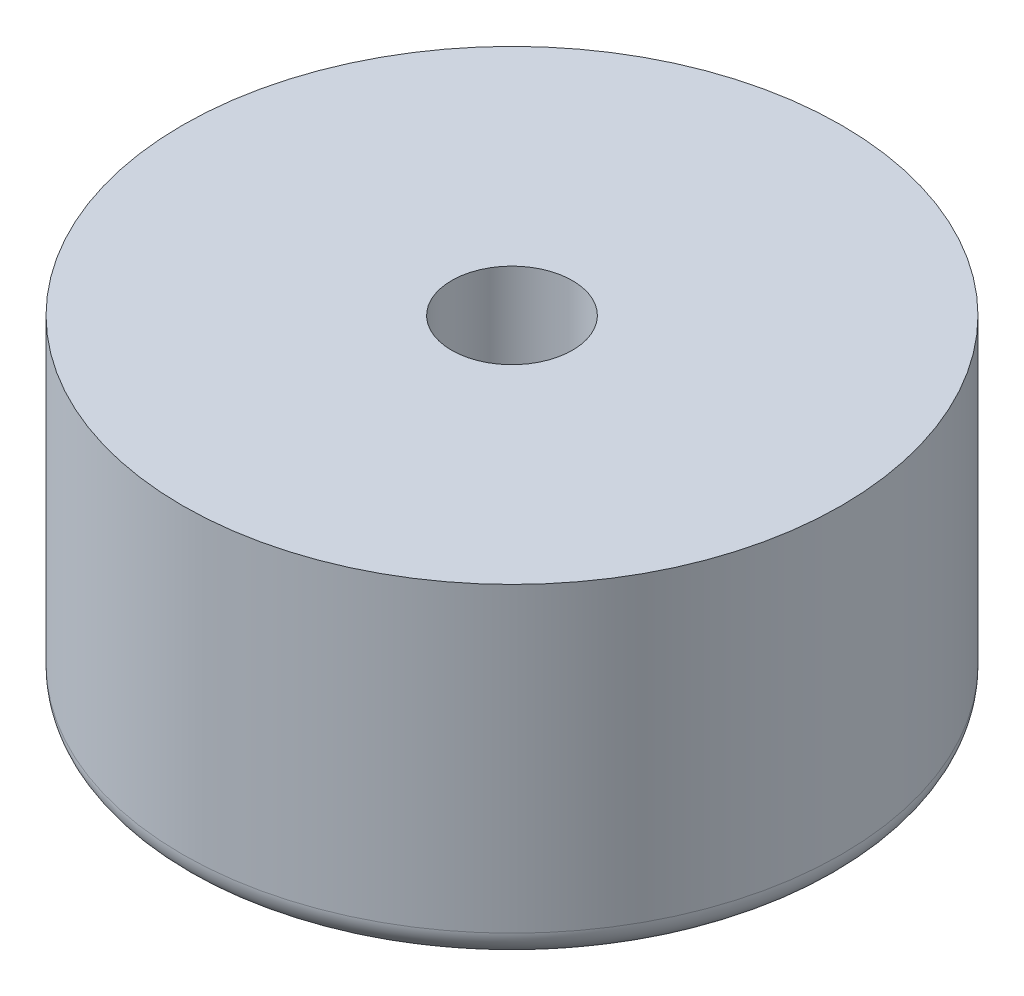
ISO-10303-21;
HEADER;
FILE_DESCRIPTION(('STEP AP214'),'2;1');
FILE_NAME('part.step','',(''),(''),'','','');
FILE_SCHEMA(('AUTOMOTIVE_DESIGN { 1 0 10303 214 1 1 1 1 }'));
ENDSEC;
DATA;
#1=APPLICATION_CONTEXT('core data for automotive mechanical design processes');
#2=APPLICATION_PROTOCOL_DEFINITION('international standard','automotive_design',2000,#1);
#3=PRODUCT_CONTEXT('',#1,'mechanical');
#4=PRODUCT('Part','Part','',(#3));
#5=PRODUCT_RELATED_PRODUCT_CATEGORY('part','',(#4));
#6=PRODUCT_DEFINITION_FORMATION('','',#4);
#7=PRODUCT_DEFINITION_CONTEXT('part definition',#1,'design');
#8=PRODUCT_DEFINITION('design','',#6,#7);
#9=PRODUCT_DEFINITION_SHAPE('','',#8);
#10=(LENGTH_UNIT() NAMED_UNIT(*) SI_UNIT(.MILLI.,.METRE.));
#11=(NAMED_UNIT(*) PLANE_ANGLE_UNIT() SI_UNIT($,.RADIAN.));
#12=(NAMED_UNIT(*) SI_UNIT($,.STERADIAN.) SOLID_ANGLE_UNIT());
#13=UNCERTAINTY_MEASURE_WITH_UNIT(LENGTH_MEASURE(1.E-05),#10,'distance_accuracy_value','');
#14=(GEOMETRIC_REPRESENTATION_CONTEXT(3) GLOBAL_UNCERTAINTY_ASSIGNED_CONTEXT((#13)) GLOBAL_UNIT_ASSIGNED_CONTEXT((#10,
#11,#12)) REPRESENTATION_CONTEXT('',''));
#15=CARTESIAN_POINT('',(0.,0.,0.));
#16=DIRECTION('',(0.,0.,1.));
#17=DIRECTION('',(1.,0.,0.));
#18=AXIS2_PLACEMENT_3D('',#15,#16,#17);
#19=CARTESIAN_POINT('',(0.,6.,0.));
#20=DIRECTION('',(0.,-1.,0.));
#21=DIRECTION('',(0.,0.,-1.));
#22=AXIS2_PLACEMENT_3D('',#19,#20,#21);
#23=CYLINDRICAL_SURFACE('',#22,6.);
#24=CARTESIAN_POINT('',(0.,0.5,0.));
#25=DIRECTION('',(0.,1.,0.));
#26=DIRECTION('',(0.,0.,1.));
#27=AXIS2_PLACEMENT_3D('',#24,#25,#26);
#28=CIRCLE('',#27,6.);
#29=CARTESIAN_POINT('',(0.,0.5,6.));
#30=VERTEX_POINT('',#29);
#31=EDGE_CURVE('E45',#30,#30,#28,.T.);
#32=ORIENTED_EDGE('',*,*,#31,.T.);
#33=EDGE_LOOP('',(#32));
#34=FACE_BOUND('',#33,.T.);
#35=CARTESIAN_POINT('',(0.,6.,0.));
#36=DIRECTION('',(0.,1.,0.));
#37=DIRECTION('',(0.,0.,1.));
#38=AXIS2_PLACEMENT_3D('',#35,#36,#37);
#39=CIRCLE('',#38,6.);
#40=CARTESIAN_POINT('',(0.,6.,6.));
#41=VERTEX_POINT('',#40);
#42=EDGE_CURVE('E50',#41,#41,#39,.T.);
#43=ORIENTED_EDGE('',*,*,#42,.F.);
#44=EDGE_LOOP('',(#43));
#45=FACE_BOUND('',#44,.T.);
#46=ADVANCED_FACE('F37',(#34,#45),#23,.T.);
#47=CARTESIAN_POINT('',(0.,6.,0.));
#48=DIRECTION('',(0.,1.,0.));
#49=DIRECTION('',(0.,0.,1.));
#50=AXIS2_PLACEMENT_3D('',#47,#48,#49);
#51=PLANE('',#50);
#52=CARTESIAN_POINT('',(0.,6.,0.));
#53=DIRECTION('',(0.,1.,0.));
#54=DIRECTION('',(0.,0.,1.));
#55=AXIS2_PLACEMENT_3D('',#52,#53,#54);
#56=CIRCLE('',#55,1.1);
#57=CARTESIAN_POINT('',(0.,6.,1.1));
#58=VERTEX_POINT('',#57);
#59=EDGE_CURVE('E58',#58,#58,#56,.T.);
#60=ORIENTED_EDGE('',*,*,#59,.F.);
#61=EDGE_LOOP('',(#60));
#62=FACE_BOUND('',#61,.T.);
#63=ORIENTED_EDGE('',*,*,#42,.T.);
#64=EDGE_LOOP('',(#63));
#65=FACE_BOUND('',#64,.T.);
#66=ADVANCED_FACE('F75',(#62,#65),#51,.T.);
#67=CARTESIAN_POINT('',(0.,0.,0.));
#68=DIRECTION('',(0.,1.,0.));
#69=DIRECTION('',(0.,0.,1.));
#70=AXIS2_PLACEMENT_3D('',#67,#68,#69);
#71=PLANE('',#70);
#72=CARTESIAN_POINT('',(0.,0.,0.));
#73=DIRECTION('',(0.,1.,0.));
#74=DIRECTION('',(0.,0.,1.));
#75=AXIS2_PLACEMENT_3D('',#72,#73,#74);
#76=CIRCLE('',#75,5.5);
#77=CARTESIAN_POINT('',(0.,0.,5.5));
#78=VERTEX_POINT('',#77);
#79=EDGE_CURVE('E10',#78,#78,#76,.F.);
#80=ORIENTED_EDGE('',*,*,#79,.T.);
#81=EDGE_LOOP('',(#80));
#82=FACE_BOUND('',#81,.T.);
#83=ADVANCED_FACE('F71',(#82),#71,.F.);
#84=CARTESIAN_POINT('',(0.,1.7,0.));
#85=DIRECTION('',(0.,1.,0.));
#86=DIRECTION('',(0.,0.,1.));
#87=AXIS2_PLACEMENT_3D('',#84,#85,#86);
#88=CYLINDRICAL_SURFACE('',#87,1.1);
#89=CARTESIAN_POINT('',(0.,1.7,0.));
#90=DIRECTION('',(0.,1.,0.));
#91=DIRECTION('',(0.,0.,1.));
#92=AXIS2_PLACEMENT_3D('',#89,#90,#91);
#93=CIRCLE('',#92,1.1);
#94=CARTESIAN_POINT('',(0.,1.7,1.1));
#95=VERTEX_POINT('',#94);
#96=EDGE_CURVE('E55',#95,#95,#93,.T.);
#97=CARTESIAN_POINT('',(0.,1.7,1.1));
#98=CARTESIAN_POINT('',(0.,1.74479166666667,1.1));
#99=CARTESIAN_POINT('',(0.,1.78958333333333,1.1));
#100=CARTESIAN_POINT('',(0.,1.87916666666667,1.1));
#101=CARTESIAN_POINT('',(0.,1.92395833333333,1.1));
#102=CARTESIAN_POINT('',(0.,2.01354166666667,1.1));
#103=CARTESIAN_POINT('',(0.,2.05833333333333,1.1));
#104=CARTESIAN_POINT('',(0.,2.14791666666667,1.1));
#105=CARTESIAN_POINT('',(0.,2.19270833333333,1.1));
#106=CARTESIAN_POINT('',(0.,2.28229166666667,1.1));
#107=CARTESIAN_POINT('',(0.,2.32708333333333,1.1));
#108=CARTESIAN_POINT('',(0.,2.41666666666667,1.1));
#109=CARTESIAN_POINT('',(0.,2.46145833333333,1.1));
#110=CARTESIAN_POINT('',(0.,2.55104166666667,1.1));
#111=CARTESIAN_POINT('',(0.,2.59583333333333,1.1));
#112=CARTESIAN_POINT('',(0.,2.68541666666667,1.1));
#113=CARTESIAN_POINT('',(0.,2.73020833333333,1.1));
#114=CARTESIAN_POINT('',(0.,2.81979166666667,1.1));
#115=CARTESIAN_POINT('',(0.,2.86458333333333,1.1));
#116=CARTESIAN_POINT('',(0.,2.95416666666667,1.1));
#117=CARTESIAN_POINT('',(0.,2.99895833333333,1.1));
#118=CARTESIAN_POINT('',(0.,3.08854166666667,1.1));
#119=CARTESIAN_POINT('',(0.,3.13333333333333,1.1));
#120=CARTESIAN_POINT('',(0.,3.22291666666667,1.1));
#121=CARTESIAN_POINT('',(0.,3.26770833333333,1.1));
#122=CARTESIAN_POINT('',(0.,3.35729166666667,1.1));
#123=CARTESIAN_POINT('',(0.,3.40208333333333,1.1));
#124=CARTESIAN_POINT('',(0.,3.49166666666667,1.1));
#125=CARTESIAN_POINT('',(0.,3.53645833333333,1.1));
#126=CARTESIAN_POINT('',(0.,3.62604166666667,1.1));
#127=CARTESIAN_POINT('',(0.,3.67083333333333,1.1));
#128=CARTESIAN_POINT('',(0.,3.76041666666667,1.1));
#129=CARTESIAN_POINT('',(0.,3.80520833333333,1.1));
#130=CARTESIAN_POINT('',(0.,3.89479166666667,1.1));
#131=CARTESIAN_POINT('',(0.,3.93958333333333,1.1));
#132=CARTESIAN_POINT('',(0.,4.02916666666667,1.1));
#133=CARTESIAN_POINT('',(0.,4.07395833333333,1.1));
#134=CARTESIAN_POINT('',(0.,4.16354166666667,1.1));
#135=CARTESIAN_POINT('',(0.,4.20833333333333,1.1));
#136=CARTESIAN_POINT('',(0.,4.29791666666667,1.1));
#137=CARTESIAN_POINT('',(0.,4.34270833333333,1.1));
#138=CARTESIAN_POINT('',(0.,4.43229166666667,1.1));
#139=CARTESIAN_POINT('',(0.,4.47708333333333,1.1));
#140=CARTESIAN_POINT('',(0.,4.56666666666667,1.1));
#141=CARTESIAN_POINT('',(0.,4.61145833333333,1.1));
#142=CARTESIAN_POINT('',(0.,4.70104166666667,1.1));
#143=CARTESIAN_POINT('',(0.,4.74583333333333,1.1));
#144=CARTESIAN_POINT('',(0.,4.83541666666667,1.1));
#145=CARTESIAN_POINT('',(0.,4.88020833333333,1.1));
#146=CARTESIAN_POINT('',(0.,4.96979166666667,1.1));
#147=CARTESIAN_POINT('',(0.,5.01458333333333,1.1));
#148=CARTESIAN_POINT('',(0.,5.10416666666667,1.1));
#149=CARTESIAN_POINT('',(0.,5.14895833333333,1.1));
#150=CARTESIAN_POINT('',(0.,5.23854166666667,1.1));
#151=CARTESIAN_POINT('',(0.,5.28333333333333,1.1));
#152=CARTESIAN_POINT('',(0.,5.37291666666667,1.1));
#153=CARTESIAN_POINT('',(0.,5.41770833333333,1.1));
#154=CARTESIAN_POINT('',(0.,5.50729166666667,1.1));
#155=CARTESIAN_POINT('',(0.,5.55208333333333,1.1));
#156=CARTESIAN_POINT('',(0.,5.64166666666667,1.1));
#157=CARTESIAN_POINT('',(0.,5.68645833333333,1.1));
#158=CARTESIAN_POINT('',(0.,5.77604166666667,1.1));
#159=CARTESIAN_POINT('',(0.,5.82083333333333,1.1));
#160=CARTESIAN_POINT('',(0.,5.91041666666667,1.1));
#161=CARTESIAN_POINT('',(0.,5.95520833333333,1.1));
#162=CARTESIAN_POINT('',(0.,6.,1.1));
#163=B_SPLINE_CURVE_WITH_KNOTS('',3,(#97,#98,#99,#100,#101,#102,#103,#104,#105,#106,#107,#108,
#109,#110,#111,#112,#113,#114,#115,#116,#117,#118,#119,#120,#121,#122,#123,#124,#125,#126,#127,
#128,#129,#130,#131,#132,#133,#134,#135,#136,#137,#138,#139,#140,#141,#142,#143,#144,#145,#146,
#147,#148,#149,#150,#151,#152,#153,#154,#155,#156,#157,#158,#159,#160,#161,#162),.UNSPECIFIED.,
.F.,.F.,(4,2,2,2,2,2,2,2,2,2,2,2,2,2,2,2,2,2,2,2,2,2,2,2,2,2,2,2,2,2,2,2,4),(0.,0.134375,
0.26875,0.403125,0.5375,0.671875,0.80625,0.940625,1.075,1.209375,1.34375,1.478125,1.6125,
1.746875,1.88125,2.015625,2.15,2.284375,2.41875,2.553125,2.6875,2.821875,2.95625,3.090625,3.225,
3.359375,3.49375,3.628125,3.7625,3.896875,4.03125,4.165625,4.3),.UNSPECIFIED.);
#164=EDGE_CURVE('BSEAM68',#95,#58,#163,.T.);
#165=ORIENTED_EDGE('',*,*,#96,.F.);
#166=ORIENTED_EDGE('',*,*,#59,.T.);
#167=ORIENTED_EDGE('',*,*,#164,.T.);
#168=ORIENTED_EDGE('',*,*,#164,.F.);
#169=EDGE_LOOP('',(#165,#167,#166,#168));
#170=FACE_BOUND('',#169,.T.);
#171=ADVANCED_FACE('F68',(#170),#88,.F.);
#172=CARTESIAN_POINT('',(0.,1.7,0.));
#173=DIRECTION('',(0.,1.,0.));
#174=DIRECTION('',(0.,0.,1.));
#175=AXIS2_PLACEMENT_3D('',#172,#173,#174);
#176=PLANE('',#175);
#177=ORIENTED_EDGE('',*,*,#96,.T.);
#178=EDGE_LOOP('',(#177));
#179=FACE_BOUND('',#178,.T.);
#180=ADVANCED_FACE('F66',(#179),#176,.T.);
#181=CARTESIAN_POINT('',(0.,0.5,0.));
#182=DIRECTION('',(0.,1.,0.));
#183=DIRECTION('',(0.,0.,1.));
#184=AXIS2_PLACEMENT_3D('',#181,#182,#183);
#185=TOROIDAL_SURFACE('',#184,5.5,0.5);
#186=ORIENTED_EDGE('',*,*,#79,.F.);
#187=EDGE_LOOP('',(#186));
#188=FACE_BOUND('',#187,.T.);
#189=ORIENTED_EDGE('',*,*,#31,.F.);
#190=EDGE_LOOP('',(#189));
#191=FACE_BOUND('',#190,.T.);
#192=ADVANCED_FACE('F39',(#188,#191),#185,.T.);
#193=CLOSED_SHELL('',(#46,#66,#83,#171,#180,#192));
#194=MANIFOLD_SOLID_BREP('B2',#193);
#195=ADVANCED_BREP_SHAPE_REPRESENTATION('',(#18,#194),#14);
#196=SHAPE_DEFINITION_REPRESENTATION(#9,#195);
ENDSEC;
END-ISO-10303-21;
